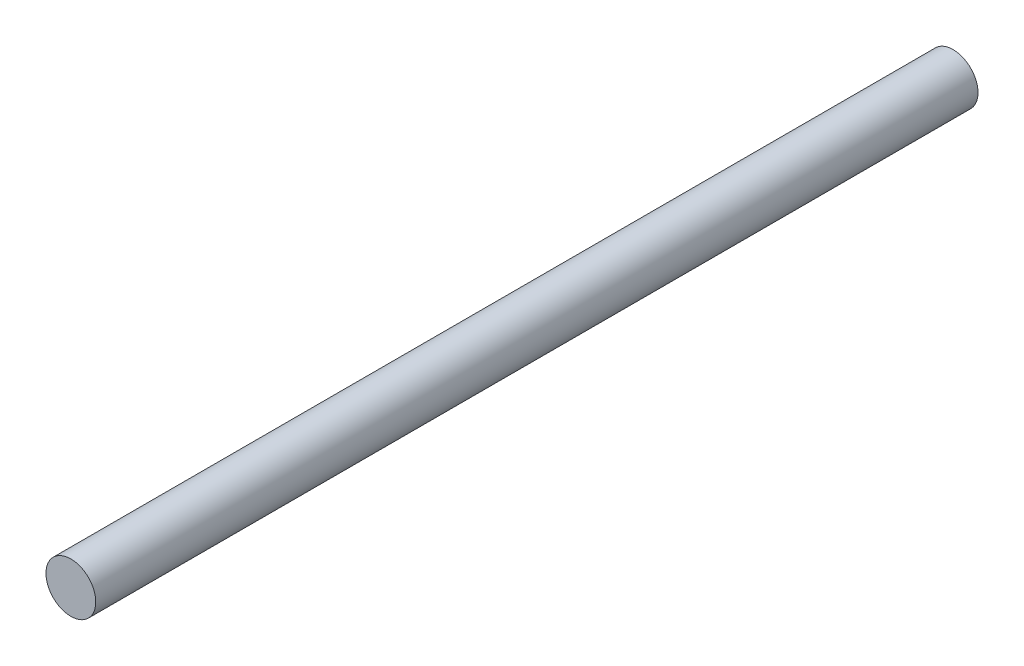
ISO-10303-21;
HEADER;
FILE_DESCRIPTION(('STEP AP214'),'2;1');
FILE_NAME('part.step','',(''),(''),'','','');
FILE_SCHEMA(('AUTOMOTIVE_DESIGN { 1 0 10303 214 1 1 1 1 }'));
ENDSEC;
DATA;
#1=APPLICATION_CONTEXT('core data for automotive mechanical design processes');
#2=APPLICATION_PROTOCOL_DEFINITION('international standard','automotive_design',2000,#1);
#3=PRODUCT_CONTEXT('',#1,'mechanical');
#4=PRODUCT('Part','Part','',(#3));
#5=PRODUCT_RELATED_PRODUCT_CATEGORY('part','',(#4));
#6=PRODUCT_DEFINITION_FORMATION('','',#4);
#7=PRODUCT_DEFINITION_CONTEXT('part definition',#1,'design');
#8=PRODUCT_DEFINITION('design','',#6,#7);
#9=PRODUCT_DEFINITION_SHAPE('','',#8);
#10=(LENGTH_UNIT() NAMED_UNIT(*) SI_UNIT(.MILLI.,.METRE.));
#11=(NAMED_UNIT(*) PLANE_ANGLE_UNIT() SI_UNIT($,.RADIAN.));
#12=(NAMED_UNIT(*) SI_UNIT($,.STERADIAN.) SOLID_ANGLE_UNIT());
#13=UNCERTAINTY_MEASURE_WITH_UNIT(LENGTH_MEASURE(1.E-05),#10,'distance_accuracy_value','');
#14=(GEOMETRIC_REPRESENTATION_CONTEXT(3) GLOBAL_UNCERTAINTY_ASSIGNED_CONTEXT((#13)) GLOBAL_UNIT_ASSIGNED_CONTEXT((#10,
#11,#12)) REPRESENTATION_CONTEXT('',''));
#15=CARTESIAN_POINT('',(0.,0.,0.));
#16=DIRECTION('',(0.,0.,1.));
#17=DIRECTION('',(1.,0.,0.));
#18=AXIS2_PLACEMENT_3D('',#15,#16,#17);
#19=CARTESIAN_POINT('',(0.,0.,62.));
#20=DIRECTION('',(0.,0.,-1.));
#21=DIRECTION('',(-1.,0.,0.));
#22=AXIS2_PLACEMENT_3D('',#19,#20,#21);
#23=CYLINDRICAL_SURFACE('',#22,1.75);
#24=CARTESIAN_POINT('',(0.,0.,62.));
#25=DIRECTION('',(0.,0.,1.));
#26=DIRECTION('',(1.,0.,0.));
#27=AXIS2_PLACEMENT_3D('',#24,#25,#26);
#28=CIRCLE('',#27,1.75);
#29=CARTESIAN_POINT('',(1.75,0.,62.));
#30=VERTEX_POINT('',#29);
#31=EDGE_CURVE('E10',#30,#30,#28,.T.);
#32=ORIENTED_EDGE('',*,*,#31,.F.);
#33=EDGE_LOOP('',(#32));
#34=FACE_BOUND('',#33,.T.);
#35=CARTESIAN_POINT('',(0.,0.,0.));
#36=DIRECTION('',(0.,0.,1.));
#37=DIRECTION('',(1.,0.,0.));
#38=AXIS2_PLACEMENT_3D('',#35,#36,#37);
#39=CIRCLE('',#38,1.75);
#40=CARTESIAN_POINT('',(1.75,0.,0.));
#41=VERTEX_POINT('',#40);
#42=EDGE_CURVE('E40',#41,#41,#39,.T.);
#43=ORIENTED_EDGE('',*,*,#42,.T.);
#44=EDGE_LOOP('',(#43));
#45=FACE_BOUND('',#44,.T.);
#46=ADVANCED_FACE('F37',(#34,#45),#23,.T.);
#47=CARTESIAN_POINT('',(0.,0.,62.));
#48=DIRECTION('',(0.,0.,1.));
#49=DIRECTION('',(1.,0.,0.));
#50=AXIS2_PLACEMENT_3D('',#47,#48,#49);
#51=PLANE('',#50);
#52=ORIENTED_EDGE('',*,*,#31,.T.);
#53=EDGE_LOOP('',(#52));
#54=FACE_BOUND('',#53,.T.);
#55=ADVANCED_FACE('F54',(#54),#51,.T.);
#56=CARTESIAN_POINT('',(0.,0.,0.));
#57=DIRECTION('',(0.,0.,1.));
#58=DIRECTION('',(1.,0.,0.));
#59=AXIS2_PLACEMENT_3D('',#56,#57,#58);
#60=PLANE('',#59);
#61=ORIENTED_EDGE('',*,*,#42,.F.);
#62=EDGE_LOOP('',(#61));
#63=FACE_BOUND('',#62,.T.);
#64=ADVANCED_FACE('F52',(#63),#60,.F.);
#65=CLOSED_SHELL('',(#46,#55,#64));
#66=MANIFOLD_SOLID_BREP('B2',#65);
#67=ADVANCED_BREP_SHAPE_REPRESENTATION('',(#18,#66),#14);
#68=SHAPE_DEFINITION_REPRESENTATION(#9,#67);
ENDSEC;
END-ISO-10303-21;
